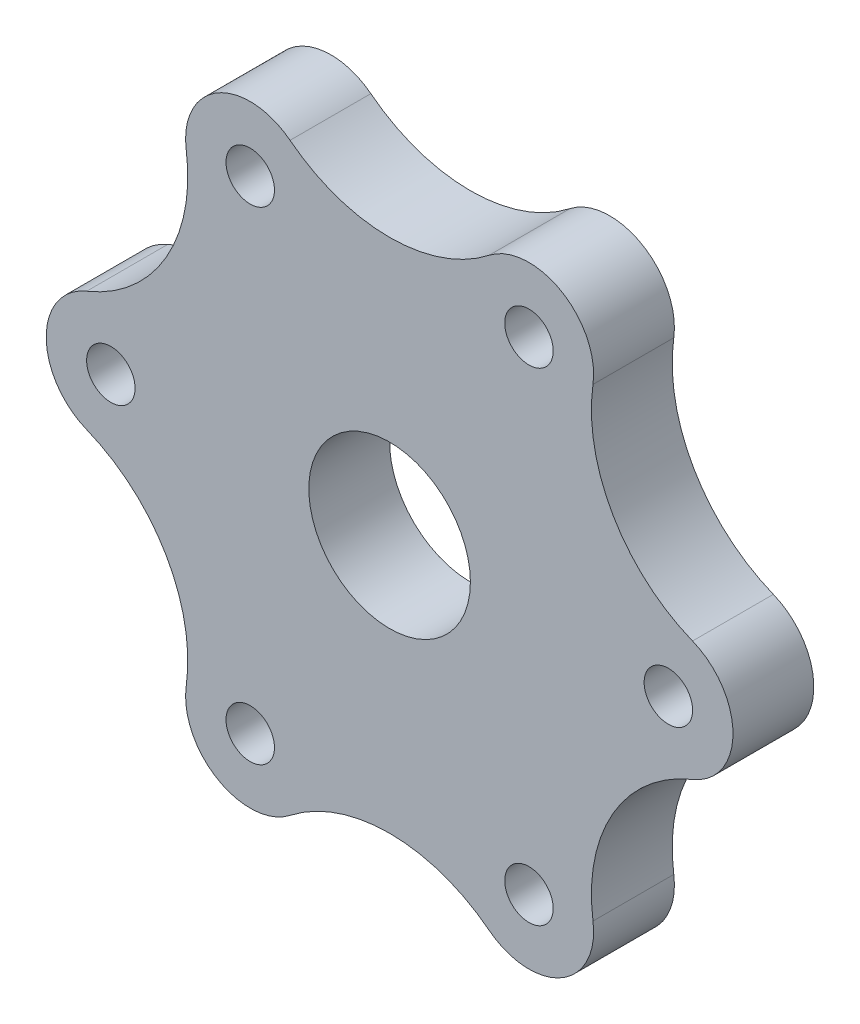
ISO-10303-21;
HEADER;
FILE_DESCRIPTION(('STEP AP214'),'2;1');
FILE_NAME('part.step','',(''),(''),'','','');
FILE_SCHEMA(('AUTOMOTIVE_DESIGN { 1 0 10303 214 1 1 1 1 }'));
ENDSEC;
DATA;
#1=APPLICATION_CONTEXT('core data for automotive mechanical design processes');
#2=APPLICATION_PROTOCOL_DEFINITION('international standard','automotive_design',2000,#1);
#3=PRODUCT_CONTEXT('',#1,'mechanical');
#4=PRODUCT('Part','Part','',(#3));
#5=PRODUCT_RELATED_PRODUCT_CATEGORY('part','',(#4));
#6=PRODUCT_DEFINITION_FORMATION('','',#4);
#7=PRODUCT_DEFINITION_CONTEXT('part definition',#1,'design');
#8=PRODUCT_DEFINITION('design','',#6,#7);
#9=PRODUCT_DEFINITION_SHAPE('','',#8);
#10=(LENGTH_UNIT() NAMED_UNIT(*) SI_UNIT(.MILLI.,.METRE.));
#11=(NAMED_UNIT(*) PLANE_ANGLE_UNIT() SI_UNIT($,.RADIAN.));
#12=(NAMED_UNIT(*) SI_UNIT($,.STERADIAN.) SOLID_ANGLE_UNIT());
#13=UNCERTAINTY_MEASURE_WITH_UNIT(LENGTH_MEASURE(1.E-05),#10,'distance_accuracy_value','');
#14=(GEOMETRIC_REPRESENTATION_CONTEXT(3) GLOBAL_UNCERTAINTY_ASSIGNED_CONTEXT((#13)) GLOBAL_UNIT_ASSIGNED_CONTEXT((#10,
#11,#12)) REPRESENTATION_CONTEXT('',''));
#15=CARTESIAN_POINT('',(0.,0.,0.));
#16=DIRECTION('',(0.,0.,1.));
#17=DIRECTION('',(1.,0.,0.));
#18=AXIS2_PLACEMENT_3D('',#15,#16,#17);
#19=CARTESIAN_POINT('',(39.7377372352733,12.9833011462506,5.));
#20=DIRECTION('',(0.,0.,1.));
#21=DIRECTION('',(1.,0.,0.));
#22=AXIS2_PLACEMENT_3D('',#19,#20,#21);
#23=PLANE('',#22);
#24=CARTESIAN_POINT('',(-34.5,0.,5.));
#25=DIRECTION('',(0.,0.,1.));
#26=DIRECTION('',(1.,0.,0.));
#27=AXIS2_PLACEMENT_3D('',#24,#25,#26);
#28=CIRCLE('',#27,2.99999999999993);
#29=CARTESIAN_POINT('',(-31.5000000000001,0.,5.));
#30=VERTEX_POINT('',#29);
#31=EDGE_CURVE('E309',#30,#30,#28,.T.);
#32=ORIENTED_EDGE('',*,*,#31,.F.);
#33=EDGE_LOOP('',(#32));
#34=FACE_BOUND('',#33,.T.);
#35=CARTESIAN_POINT('',(17.25,-29.8778764305631,5.));
#36=DIRECTION('',(0.,0.,1.));
#37=DIRECTION('',(1.,0.,0.));
#38=AXIS2_PLACEMENT_3D('',#35,#36,#37);
#39=CIRCLE('',#38,2.99999999999984);
#40=CARTESIAN_POINT('',(20.2499999999998,-29.8778764305631,5.));
#41=VERTEX_POINT('',#40);
#42=EDGE_CURVE('E321',#41,#41,#39,.T.);
#43=ORIENTED_EDGE('',*,*,#42,.F.);
#44=EDGE_LOOP('',(#43));
#45=FACE_BOUND('',#44,.T.);
#46=CARTESIAN_POINT('',(34.5,0.,5.));
#47=DIRECTION('',(0.,0.,1.));
#48=DIRECTION('',(1.,0.,0.));
#49=AXIS2_PLACEMENT_3D('',#46,#47,#48);
#50=CIRCLE('',#49,3.);
#51=CARTESIAN_POINT('',(37.5,0.,5.));
#52=VERTEX_POINT('',#51);
#53=EDGE_CURVE('E333',#52,#52,#50,.T.);
#54=ORIENTED_EDGE('',*,*,#53,.F.);
#55=EDGE_LOOP('',(#54));
#56=FACE_BOUND('',#55,.T.);
#57=CARTESIAN_POINT('',(44.9754744705465,25.9666022925012,5.));
#58=DIRECTION('',(0.,0.,-1.));
#59=DIRECTION('',(1.,0.,0.));
#60=AXIS2_PLACEMENT_3D('',#57,#58,#59);
#61=CIRCLE('',#60,20.0000000000001);
#62=CARTESIAN_POINT('',(37.4929927058704,7.4190292264289,5.));
#63=VERTEX_POINT('',#62);
#64=CARTESIAN_POINT('',(25.1715641344418,28.7603695339742,5.));
#65=VERTEX_POINT('',#64);
#66=EDGE_CURVE('E183',#63,#65,#61,.T.);
#67=ORIENTED_EDGE('',*,*,#66,.T.);
#68=CARTESIAN_POINT('',(17.25,29.8778764305631,5.));
#69=DIRECTION('',(0.,0.,1.));
#70=DIRECTION('',(1.,0.,0.));
#71=AXIS2_PLACEMENT_3D('',#68,#69,#70);
#72=CIRCLE('',#71,7.99999999999989);
#73=CARTESIAN_POINT('',(12.3214285714286,36.1793987604028,5.));
#74=VERTEX_POINT('',#73);
#75=EDGE_CURVE('E111',#65,#74,#72,.T.);
#76=ORIENTED_EDGE('',*,*,#75,.T.);
#77=CARTESIAN_POINT('',(0.,51.9332045850024,5.));
#78=DIRECTION('',(0.,0.,-1.));
#79=DIRECTION('',(1.,0.,0.));
#80=AXIS2_PLACEMENT_3D('',#77,#78,#79);
#81=CIRCLE('',#80,20.);
#82=CARTESIAN_POINT('',(-12.3214285714286,36.1793987604029,5.));
#83=VERTEX_POINT('',#82);
#84=EDGE_CURVE('E210',#74,#83,#81,.T.);
#85=ORIENTED_EDGE('',*,*,#84,.T.);
#86=CARTESIAN_POINT('',(-17.2499999999997,29.8778764305633,5.));
#87=DIRECTION('',(0.,0.,1.));
#88=DIRECTION('',(1.,0.,0.));
#89=AXIS2_PLACEMENT_3D('',#86,#87,#88);
#90=CIRCLE('',#89,7.99999999999999);
#91=CARTESIAN_POINT('',(-25.1715641344416,28.760369533974,5.));
#92=VERTEX_POINT('',#91);
#93=EDGE_CURVE('E229',#83,#92,#90,.T.);
#94=ORIENTED_EDGE('',*,*,#93,.T.);
#95=CARTESIAN_POINT('',(-44.9754744705466,25.9666022925011,5.));
#96=DIRECTION('',(0.,0.,-1.));
#97=DIRECTION('',(1.,0.,0.));
#98=AXIS2_PLACEMENT_3D('',#95,#96,#97);
#99=CIRCLE('',#98,20.0000000000001);
#100=CARTESIAN_POINT('',(-37.4929927058706,7.4190292264287,5.));
#101=VERTEX_POINT('',#100);
#102=EDGE_CURVE('E226',#92,#101,#99,.T.);
#103=ORIENTED_EDGE('',*,*,#102,.T.);
#104=CARTESIAN_POINT('',(-34.5,0.,5.));
#105=DIRECTION('',(0.,0.,1.));
#106=DIRECTION('',(1.,0.,0.));
#107=AXIS2_PLACEMENT_3D('',#104,#105,#106);
#108=CIRCLE('',#107,7.99999999999995);
#109=CARTESIAN_POINT('',(-37.4929927058703,-7.41902922642892,5.));
#110=VERTEX_POINT('',#109);
#111=EDGE_CURVE('E228',#101,#110,#108,.T.);
#112=ORIENTED_EDGE('',*,*,#111,.T.);
#113=CARTESIAN_POINT('',(-44.9754744705465,-25.9666022925012,5.));
#114=DIRECTION('',(0.,0.,-1.));
#115=DIRECTION('',(1.,0.,0.));
#116=AXIS2_PLACEMENT_3D('',#113,#114,#115);
#117=CIRCLE('',#116,20.);
#118=CARTESIAN_POINT('',(-25.1715641344418,-28.7603695339742,5.));
#119=VERTEX_POINT('',#118);
#120=EDGE_CURVE('E231',#110,#119,#117,.T.);
#121=ORIENTED_EDGE('',*,*,#120,.T.);
#122=CARTESIAN_POINT('',(-17.2499999999998,-29.8778764305633,5.));
#123=DIRECTION('',(0.,0.,1.));
#124=DIRECTION('',(1.,0.,0.));
#125=AXIS2_PLACEMENT_3D('',#122,#123,#124);
#126=CIRCLE('',#125,7.99999999999986);
#127=CARTESIAN_POINT('',(-12.3214285714285,-36.179398760403,5.));
#128=VERTEX_POINT('',#127);
#129=EDGE_CURVE('E237',#119,#128,#126,.T.);
#130=ORIENTED_EDGE('',*,*,#129,.T.);
#131=CARTESIAN_POINT('',(0.,-51.9332045850024,5.));
#132=DIRECTION('',(0.,0.,-1.));
#133=DIRECTION('',(1.,0.,0.));
#134=AXIS2_PLACEMENT_3D('',#131,#132,#133);
#135=CIRCLE('',#134,20.);
#136=CARTESIAN_POINT('',(12.3214285714286,-36.1793987604029,5.));
#137=VERTEX_POINT('',#136);
#138=EDGE_CURVE('E142',#128,#137,#135,.T.);
#139=ORIENTED_EDGE('',*,*,#138,.T.);
#140=CARTESIAN_POINT('',(17.25,-29.8778764305631,5.));
#141=DIRECTION('',(0.,0.,1.));
#142=DIRECTION('',(1.,0.,0.));
#143=AXIS2_PLACEMENT_3D('',#140,#141,#142);
#144=CIRCLE('',#143,7.99999999999999);
#145=CARTESIAN_POINT('',(25.1715641344419,-28.760369533974,5.));
#146=VERTEX_POINT('',#145);
#147=EDGE_CURVE('E136',#137,#146,#144,.T.);
#148=ORIENTED_EDGE('',*,*,#147,.T.);
#149=CARTESIAN_POINT('',(44.9754744705465,-25.9666022925012,5.));
#150=DIRECTION('',(0.,0.,-1.));
#151=DIRECTION('',(1.,0.,0.));
#152=AXIS2_PLACEMENT_3D('',#149,#150,#151);
#153=CIRCLE('',#152,20.);
#154=CARTESIAN_POINT('',(37.4929927058704,-7.41902922642888,5.));
#155=VERTEX_POINT('',#154);
#156=EDGE_CURVE('E140',#146,#155,#153,.T.);
#157=ORIENTED_EDGE('',*,*,#156,.T.);
#158=CARTESIAN_POINT('',(34.5,0.,5.));
#159=DIRECTION('',(0.,0.,1.));
#160=DIRECTION('',(1.,0.,0.));
#161=AXIS2_PLACEMENT_3D('',#158,#159,#160);
#162=CIRCLE('',#161,7.99999999999999);
#163=EDGE_CURVE('E56',#155,#63,#162,.T.);
#164=ORIENTED_EDGE('',*,*,#163,.T.);
#165=EDGE_LOOP('',(#67,#76,#85,#94,#103,#112,#121,#130,#139,#148,#157,#164));
#166=FACE_BOUND('',#165,.T.);
#167=CARTESIAN_POINT('',(0.,0.,5.));
#168=DIRECTION('',(0.,0.,1.));
#169=DIRECTION('',(1.,0.,0.));
#170=AXIS2_PLACEMENT_3D('',#167,#168,#169);
#171=CIRCLE('',#170,10.);
#172=CARTESIAN_POINT('',(10.,0.,5.));
#173=VERTEX_POINT('',#172);
#174=EDGE_CURVE('E164',#173,#173,#171,.T.);
#175=ORIENTED_EDGE('',*,*,#174,.F.);
#176=EDGE_LOOP('',(#175));
#177=FACE_BOUND('',#176,.T.);
#178=CARTESIAN_POINT('',(-17.2499999999997,29.8778764305633,5.));
#179=DIRECTION('',(0.,0.,1.));
#180=DIRECTION('',(1.,0.,0.));
#181=AXIS2_PLACEMENT_3D('',#178,#179,#180);
#182=CIRCLE('',#181,2.99999999999999);
#183=CARTESIAN_POINT('',(-14.2499999999997,29.8778764305633,5.));
#184=VERTEX_POINT('',#183);
#185=EDGE_CURVE('E327',#184,#184,#182,.T.);
#186=ORIENTED_EDGE('',*,*,#185,.F.);
#187=EDGE_LOOP('',(#186));
#188=FACE_BOUND('',#187,.T.);
#189=CARTESIAN_POINT('',(-17.2499999999998,-29.8778764305633,5.));
#190=DIRECTION('',(0.,0.,1.));
#191=DIRECTION('',(1.,0.,0.));
#192=AXIS2_PLACEMENT_3D('',#189,#190,#191);
#193=CIRCLE('',#192,2.99999999999966);
#194=CARTESIAN_POINT('',(-14.2500000000001,-29.8778764305633,5.));
#195=VERTEX_POINT('',#194);
#196=EDGE_CURVE('E315',#195,#195,#193,.T.);
#197=ORIENTED_EDGE('',*,*,#196,.F.);
#198=EDGE_LOOP('',(#197));
#199=FACE_BOUND('',#198,.T.);
#200=CARTESIAN_POINT('',(17.25,29.8778764305631,5.));
#201=DIRECTION('',(0.,0.,1.));
#202=DIRECTION('',(1.,0.,0.));
#203=AXIS2_PLACEMENT_3D('',#200,#201,#202);
#204=CIRCLE('',#203,2.99999999999988);
#205=CARTESIAN_POINT('',(20.2499999999999,29.8778764305631,5.));
#206=VERTEX_POINT('',#205);
#207=EDGE_CURVE('E300',#206,#206,#204,.T.);
#208=ORIENTED_EDGE('',*,*,#207,.F.);
#209=EDGE_LOOP('',(#208));
#210=FACE_BOUND('',#209,.T.);
#211=ADVANCED_FACE('F39',(#34,#45,#56,#166,#177,#188,#199,#210),#23,.T.);
#212=CARTESIAN_POINT('',(39.7377372352733,12.9833011462506,-5.));
#213=DIRECTION('',(0.,0.,1.));
#214=DIRECTION('',(1.,0.,0.));
#215=AXIS2_PLACEMENT_3D('',#212,#213,#214);
#216=PLANE('',#215);
#217=CARTESIAN_POINT('',(44.9754744705465,25.9666022925012,-5.));
#218=DIRECTION('',(0.,0.,-1.));
#219=DIRECTION('',(1.,0.,0.));
#220=AXIS2_PLACEMENT_3D('',#217,#218,#219);
#221=CIRCLE('',#220,20.0000000000001);
#222=CARTESIAN_POINT('',(37.4929927058704,7.4190292264289,-5.));
#223=VERTEX_POINT('',#222);
#224=CARTESIAN_POINT('',(25.1715641344418,28.7603695339742,-5.));
#225=VERTEX_POINT('',#224);
#226=EDGE_CURVE('E160',#223,#225,#221,.T.);
#227=ORIENTED_EDGE('',*,*,#226,.F.);
#228=CARTESIAN_POINT('',(34.5,0.,-5.));
#229=DIRECTION('',(0.,0.,1.));
#230=DIRECTION('',(1.,0.,0.));
#231=AXIS2_PLACEMENT_3D('',#228,#229,#230);
#232=CIRCLE('',#231,7.99999999999999);
#233=CARTESIAN_POINT('',(37.4929927058704,-7.41902922642888,-5.));
#234=VERTEX_POINT('',#233);
#235=EDGE_CURVE('E103',#234,#223,#232,.T.);
#236=ORIENTED_EDGE('',*,*,#235,.F.);
#237=CARTESIAN_POINT('',(44.9754744705465,-25.9666022925012,-5.));
#238=DIRECTION('',(0.,0.,-1.));
#239=DIRECTION('',(1.,0.,0.));
#240=AXIS2_PLACEMENT_3D('',#237,#238,#239);
#241=CIRCLE('',#240,20.);
#242=CARTESIAN_POINT('',(25.1715641344419,-28.760369533974,-5.));
#243=VERTEX_POINT('',#242);
#244=EDGE_CURVE('E97',#243,#234,#241,.T.);
#245=ORIENTED_EDGE('',*,*,#244,.F.);
#246=CARTESIAN_POINT('',(17.25,-29.8778764305631,-5.));
#247=DIRECTION('',(0.,0.,1.));
#248=DIRECTION('',(1.,0.,0.));
#249=AXIS2_PLACEMENT_3D('',#246,#247,#248);
#250=CIRCLE('',#249,7.99999999999999);
#251=CARTESIAN_POINT('',(12.3214285714286,-36.1793987604029,-5.));
#252=VERTEX_POINT('',#251);
#253=EDGE_CURVE('E150',#252,#243,#250,.T.);
#254=ORIENTED_EDGE('',*,*,#253,.F.);
#255=CARTESIAN_POINT('',(0.,-51.9332045850024,-5.));
#256=DIRECTION('',(0.,0.,-1.));
#257=DIRECTION('',(1.,0.,0.));
#258=AXIS2_PLACEMENT_3D('',#255,#256,#257);
#259=CIRCLE('',#258,20.);
#260=CARTESIAN_POINT('',(-12.3214285714285,-36.179398760403,-5.));
#261=VERTEX_POINT('',#260);
#262=EDGE_CURVE('E178',#261,#252,#259,.T.);
#263=ORIENTED_EDGE('',*,*,#262,.F.);
#264=CARTESIAN_POINT('',(-17.2499999999998,-29.8778764305633,-5.));
#265=DIRECTION('',(0.,0.,1.));
#266=DIRECTION('',(1.,0.,0.));
#267=AXIS2_PLACEMENT_3D('',#264,#265,#266);
#268=CIRCLE('',#267,7.99999999999986);
#269=CARTESIAN_POINT('',(-25.1715641344418,-28.7603695339742,-5.));
#270=VERTEX_POINT('',#269);
#271=EDGE_CURVE('E176',#270,#261,#268,.T.);
#272=ORIENTED_EDGE('',*,*,#271,.F.);
#273=CARTESIAN_POINT('',(-44.9754744705465,-25.9666022925012,-5.));
#274=DIRECTION('',(0.,0.,-1.));
#275=DIRECTION('',(1.,0.,0.));
#276=AXIS2_PLACEMENT_3D('',#273,#274,#275);
#277=CIRCLE('',#276,20.);
#278=CARTESIAN_POINT('',(-37.4929927058703,-7.41902922642892,-5.));
#279=VERTEX_POINT('',#278);
#280=EDGE_CURVE('E174',#279,#270,#277,.T.);
#281=ORIENTED_EDGE('',*,*,#280,.F.);
#282=CARTESIAN_POINT('',(-34.5,0.,-5.));
#283=DIRECTION('',(0.,0.,1.));
#284=DIRECTION('',(1.,0.,0.));
#285=AXIS2_PLACEMENT_3D('',#282,#283,#284);
#286=CIRCLE('',#285,7.99999999999995);
#287=CARTESIAN_POINT('',(-37.4929927058706,7.4190292264287,-5.));
#288=VERTEX_POINT('',#287);
#289=EDGE_CURVE('E172',#288,#279,#286,.T.);
#290=ORIENTED_EDGE('',*,*,#289,.F.);
#291=CARTESIAN_POINT('',(-44.9754744705466,25.9666022925011,-5.));
#292=DIRECTION('',(0.,0.,-1.));
#293=DIRECTION('',(1.,0.,0.));
#294=AXIS2_PLACEMENT_3D('',#291,#292,#293);
#295=CIRCLE('',#294,20.0000000000001);
#296=CARTESIAN_POINT('',(-25.1715641344416,28.760369533974,-5.));
#297=VERTEX_POINT('',#296);
#298=EDGE_CURVE('E170',#297,#288,#295,.T.);
#299=ORIENTED_EDGE('',*,*,#298,.F.);
#300=CARTESIAN_POINT('',(-17.2499999999997,29.8778764305633,-5.));
#301=DIRECTION('',(0.,0.,1.));
#302=DIRECTION('',(1.,0.,0.));
#303=AXIS2_PLACEMENT_3D('',#300,#301,#302);
#304=CIRCLE('',#303,7.99999999999999);
#305=CARTESIAN_POINT('',(-12.3214285714286,36.1793987604029,-5.));
#306=VERTEX_POINT('',#305);
#307=EDGE_CURVE('E168',#306,#297,#304,.T.);
#308=ORIENTED_EDGE('',*,*,#307,.F.);
#309=CARTESIAN_POINT('',(0.,51.9332045850024,-5.));
#310=DIRECTION('',(0.,0.,-1.));
#311=DIRECTION('',(1.,0.,0.));
#312=AXIS2_PLACEMENT_3D('',#309,#310,#311);
#313=CIRCLE('',#312,20.);
#314=CARTESIAN_POINT('',(12.3214285714286,36.1793987604028,-5.));
#315=VERTEX_POINT('',#314);
#316=EDGE_CURVE('E166',#315,#306,#313,.T.);
#317=ORIENTED_EDGE('',*,*,#316,.F.);
#318=CARTESIAN_POINT('',(17.25,29.8778764305631,-5.));
#319=DIRECTION('',(0.,0.,1.));
#320=DIRECTION('',(1.,0.,0.));
#321=AXIS2_PLACEMENT_3D('',#318,#319,#320);
#322=CIRCLE('',#321,7.99999999999989);
#323=EDGE_CURVE('E163',#225,#315,#322,.T.);
#324=ORIENTED_EDGE('',*,*,#323,.F.);
#325=EDGE_LOOP('',(#227,#236,#245,#254,#263,#272,#281,#290,#299,#308,#317,#324));
#326=FACE_BOUND('',#325,.T.);
#327=CARTESIAN_POINT('',(0.,0.,-5.));
#328=DIRECTION('',(0.,0.,1.));
#329=DIRECTION('',(1.,0.,0.));
#330=AXIS2_PLACEMENT_3D('',#327,#328,#329);
#331=CIRCLE('',#330,10.);
#332=CARTESIAN_POINT('',(10.,0.,-5.));
#333=VERTEX_POINT('',#332);
#334=EDGE_CURVE('E336',#333,#333,#331,.T.);
#335=ORIENTED_EDGE('',*,*,#334,.T.);
#336=EDGE_LOOP('',(#335));
#337=FACE_BOUND('',#336,.T.);
#338=CARTESIAN_POINT('',(34.5,0.,-5.));
#339=DIRECTION('',(0.,0.,1.));
#340=DIRECTION('',(1.,0.,0.));
#341=AXIS2_PLACEMENT_3D('',#338,#339,#340);
#342=CIRCLE('',#341,3.);
#343=CARTESIAN_POINT('',(37.5,0.,-5.));
#344=VERTEX_POINT('',#343);
#345=EDGE_CURVE('E330',#344,#344,#342,.T.);
#346=ORIENTED_EDGE('',*,*,#345,.T.);
#347=EDGE_LOOP('',(#346));
#348=FACE_BOUND('',#347,.T.);
#349=CARTESIAN_POINT('',(-17.2499999999997,29.8778764305633,-5.));
#350=DIRECTION('',(0.,0.,1.));
#351=DIRECTION('',(1.,0.,0.));
#352=AXIS2_PLACEMENT_3D('',#349,#350,#351);
#353=CIRCLE('',#352,2.99999999999999);
#354=CARTESIAN_POINT('',(-14.2499999999997,29.8778764305633,-5.));
#355=VERTEX_POINT('',#354);
#356=EDGE_CURVE('E324',#355,#355,#353,.T.);
#357=ORIENTED_EDGE('',*,*,#356,.T.);
#358=EDGE_LOOP('',(#357));
#359=FACE_BOUND('',#358,.T.);
#360=CARTESIAN_POINT('',(17.25,-29.8778764305631,-5.));
#361=DIRECTION('',(0.,0.,1.));
#362=DIRECTION('',(1.,0.,0.));
#363=AXIS2_PLACEMENT_3D('',#360,#361,#362);
#364=CIRCLE('',#363,2.99999999999984);
#365=CARTESIAN_POINT('',(20.2499999999998,-29.8778764305631,-5.));
#366=VERTEX_POINT('',#365);
#367=EDGE_CURVE('E318',#366,#366,#364,.T.);
#368=ORIENTED_EDGE('',*,*,#367,.T.);
#369=EDGE_LOOP('',(#368));
#370=FACE_BOUND('',#369,.T.);
#371=CARTESIAN_POINT('',(-17.2499999999998,-29.8778764305633,-5.));
#372=DIRECTION('',(0.,0.,1.));
#373=DIRECTION('',(1.,0.,0.));
#374=AXIS2_PLACEMENT_3D('',#371,#372,#373);
#375=CIRCLE('',#374,2.99999999999966);
#376=CARTESIAN_POINT('',(-14.2500000000001,-29.8778764305633,-5.));
#377=VERTEX_POINT('',#376);
#378=EDGE_CURVE('E312',#377,#377,#375,.T.);
#379=ORIENTED_EDGE('',*,*,#378,.T.);
#380=EDGE_LOOP('',(#379));
#381=FACE_BOUND('',#380,.T.);
#382=CARTESIAN_POINT('',(-34.5,0.,-5.));
#383=DIRECTION('',(0.,0.,1.));
#384=DIRECTION('',(1.,0.,0.));
#385=AXIS2_PLACEMENT_3D('',#382,#383,#384);
#386=CIRCLE('',#385,2.99999999999993);
#387=CARTESIAN_POINT('',(-31.5000000000001,0.,-5.));
#388=VERTEX_POINT('',#387);
#389=EDGE_CURVE('E306',#388,#388,#386,.T.);
#390=ORIENTED_EDGE('',*,*,#389,.T.);
#391=EDGE_LOOP('',(#390));
#392=FACE_BOUND('',#391,.T.);
#393=CARTESIAN_POINT('',(17.25,29.8778764305631,-5.));
#394=DIRECTION('',(0.,0.,1.));
#395=DIRECTION('',(1.,0.,0.));
#396=AXIS2_PLACEMENT_3D('',#393,#394,#395);
#397=CIRCLE('',#396,2.99999999999988);
#398=CARTESIAN_POINT('',(20.2499999999999,29.8778764305631,-5.));
#399=VERTEX_POINT('',#398);
#400=EDGE_CURVE('E303',#399,#399,#397,.T.);
#401=ORIENTED_EDGE('',*,*,#400,.T.);
#402=EDGE_LOOP('',(#401));
#403=FACE_BOUND('',#402,.T.);
#404=ADVANCED_FACE('F214',(#326,#337,#348,#359,#370,#381,#392,#403),#216,.F.);
#405=CARTESIAN_POINT('',(44.9754744705465,25.9666022925012,5.));
#406=DIRECTION('',(0.,0.,-1.));
#407=DIRECTION('',(-1.,0.,0.));
#408=AXIS2_PLACEMENT_3D('',#405,#406,#407);
#409=CYLINDRICAL_SURFACE('',#408,20.0000000000001);
#410=ORIENTED_EDGE('',*,*,#226,.T.);
#411=DIRECTION('',(0.,0.,-1.));
#412=VECTOR('',#411,1.);
#413=CARTESIAN_POINT('',(25.1715641344418,28.7603695339742,5.));
#414=LINE('',#413,#412);
#415=EDGE_CURVE('E11',#65,#225,#414,.T.);
#416=ORIENTED_EDGE('',*,*,#415,.F.);
#417=ORIENTED_EDGE('',*,*,#66,.F.);
#418=DIRECTION('',(0.,0.,-1.));
#419=VECTOR('',#418,1.);
#420=CARTESIAN_POINT('',(37.4929927058704,7.4190292264289,5.));
#421=LINE('',#420,#419);
#422=EDGE_CURVE('E156',#63,#223,#421,.T.);
#423=ORIENTED_EDGE('',*,*,#422,.T.);
#424=EDGE_LOOP('',(#410,#416,#417,#423));
#425=FACE_BOUND('',#424,.T.);
#426=ADVANCED_FACE('F41',(#425),#409,.F.);
#427=CARTESIAN_POINT('',(17.25,29.8778764305631,5.));
#428=DIRECTION('',(0.,0.,-1.));
#429=DIRECTION('',(-1.,0.,0.));
#430=AXIS2_PLACEMENT_3D('',#427,#428,#429);
#431=CYLINDRICAL_SURFACE('',#430,7.99999999999989);
#432=ORIENTED_EDGE('',*,*,#323,.T.);
#433=DIRECTION('',(0.,0.,-1.));
#434=VECTOR('',#433,1.);
#435=CARTESIAN_POINT('',(12.3214285714286,36.1793987604028,5.));
#436=LINE('',#435,#434);
#437=EDGE_CURVE('E48',#74,#315,#436,.T.);
#438=ORIENTED_EDGE('',*,*,#437,.F.);
#439=ORIENTED_EDGE('',*,*,#75,.F.);
#440=ORIENTED_EDGE('',*,*,#415,.T.);
#441=EDGE_LOOP('',(#432,#438,#439,#440));
#442=FACE_BOUND('',#441,.T.);
#443=ADVANCED_FACE('F446',(#442),#431,.T.);
#444=CARTESIAN_POINT('',(0.,51.9332045850024,5.));
#445=DIRECTION('',(0.,0.,-1.));
#446=DIRECTION('',(-1.,0.,0.));
#447=AXIS2_PLACEMENT_3D('',#444,#445,#446);
#448=CYLINDRICAL_SURFACE('',#447,20.);
#449=ORIENTED_EDGE('',*,*,#316,.T.);
#450=DIRECTION('',(0.,0.,-1.));
#451=VECTOR('',#450,1.);
#452=CARTESIAN_POINT('',(-12.3214285714286,36.1793987604029,5.));
#453=LINE('',#452,#451);
#454=EDGE_CURVE('E202',#83,#306,#453,.T.);
#455=ORIENTED_EDGE('',*,*,#454,.F.);
#456=ORIENTED_EDGE('',*,*,#84,.F.);
#457=ORIENTED_EDGE('',*,*,#437,.T.);
#458=EDGE_LOOP('',(#449,#455,#456,#457));
#459=FACE_BOUND('',#458,.T.);
#460=ADVANCED_FACE('F208',(#459),#448,.F.);
#461=CARTESIAN_POINT('',(-17.2499999999997,29.8778764305633,5.));
#462=DIRECTION('',(0.,0.,-1.));
#463=DIRECTION('',(-1.,0.,0.));
#464=AXIS2_PLACEMENT_3D('',#461,#462,#463);
#465=CYLINDRICAL_SURFACE('',#464,7.99999999999999);
#466=ORIENTED_EDGE('',*,*,#307,.T.);
#467=DIRECTION('',(0.,0.,-1.));
#468=VECTOR('',#467,1.);
#469=CARTESIAN_POINT('',(-25.1715641344416,28.760369533974,5.));
#470=LINE('',#469,#468);
#471=EDGE_CURVE('E199',#92,#297,#470,.T.);
#472=ORIENTED_EDGE('',*,*,#471,.F.);
#473=ORIENTED_EDGE('',*,*,#93,.F.);
#474=ORIENTED_EDGE('',*,*,#454,.T.);
#475=EDGE_LOOP('',(#466,#472,#473,#474));
#476=FACE_BOUND('',#475,.T.);
#477=ADVANCED_FACE('F220',(#476),#465,.T.);
#478=CARTESIAN_POINT('',(-44.9754744705466,25.9666022925011,5.));
#479=DIRECTION('',(0.,0.,-1.));
#480=DIRECTION('',(-1.,0.,0.));
#481=AXIS2_PLACEMENT_3D('',#478,#479,#480);
#482=CYLINDRICAL_SURFACE('',#481,20.0000000000001);
#483=ORIENTED_EDGE('',*,*,#298,.T.);
#484=DIRECTION('',(0.,0.,-1.));
#485=VECTOR('',#484,1.);
#486=CARTESIAN_POINT('',(-37.4929927058706,7.4190292264287,5.));
#487=LINE('',#486,#485);
#488=EDGE_CURVE('E196',#101,#288,#487,.T.);
#489=ORIENTED_EDGE('',*,*,#488,.F.);
#490=ORIENTED_EDGE('',*,*,#102,.F.);
#491=ORIENTED_EDGE('',*,*,#471,.T.);
#492=EDGE_LOOP('',(#483,#489,#490,#491));
#493=FACE_BOUND('',#492,.T.);
#494=ADVANCED_FACE('F224',(#493),#482,.F.);
#495=CARTESIAN_POINT('',(-34.5,0.,5.));
#496=DIRECTION('',(0.,0.,-1.));
#497=DIRECTION('',(-1.,0.,0.));
#498=AXIS2_PLACEMENT_3D('',#495,#496,#497);
#499=CYLINDRICAL_SURFACE('',#498,7.99999999999995);
#500=ORIENTED_EDGE('',*,*,#289,.T.);
#501=DIRECTION('',(0.,0.,-1.));
#502=VECTOR('',#501,1.);
#503=CARTESIAN_POINT('',(-37.4929927058703,-7.41902922642892,5.));
#504=LINE('',#503,#502);
#505=EDGE_CURVE('E193',#110,#279,#504,.T.);
#506=ORIENTED_EDGE('',*,*,#505,.F.);
#507=ORIENTED_EDGE('',*,*,#111,.F.);
#508=ORIENTED_EDGE('',*,*,#488,.T.);
#509=EDGE_LOOP('',(#500,#506,#507,#508));
#510=FACE_BOUND('',#509,.T.);
#511=ADVANCED_FACE('F419',(#510),#499,.T.);
#512=CARTESIAN_POINT('',(-44.9754744705465,-25.9666022925012,5.));
#513=DIRECTION('',(0.,0.,-1.));
#514=DIRECTION('',(-1.,0.,0.));
#515=AXIS2_PLACEMENT_3D('',#512,#513,#514);
#516=CYLINDRICAL_SURFACE('',#515,20.);
#517=ORIENTED_EDGE('',*,*,#280,.T.);
#518=DIRECTION('',(0.,0.,-1.));
#519=VECTOR('',#518,1.);
#520=CARTESIAN_POINT('',(-25.1715641344418,-28.7603695339742,5.));
#521=LINE('',#520,#519);
#522=EDGE_CURVE('E190',#119,#270,#521,.T.);
#523=ORIENTED_EDGE('',*,*,#522,.F.);
#524=ORIENTED_EDGE('',*,*,#120,.F.);
#525=ORIENTED_EDGE('',*,*,#505,.T.);
#526=EDGE_LOOP('',(#517,#523,#524,#525));
#527=FACE_BOUND('',#526,.T.);
#528=ADVANCED_FACE('F424',(#527),#516,.F.);
#529=CARTESIAN_POINT('',(-17.2499999999998,-29.8778764305633,5.));
#530=DIRECTION('',(0.,0.,-1.));
#531=DIRECTION('',(-1.,0.,0.));
#532=AXIS2_PLACEMENT_3D('',#529,#530,#531);
#533=CYLINDRICAL_SURFACE('',#532,7.99999999999986);
#534=ORIENTED_EDGE('',*,*,#271,.T.);
#535=DIRECTION('',(0.,0.,-1.));
#536=VECTOR('',#535,1.);
#537=CARTESIAN_POINT('',(-12.3214285714285,-36.179398760403,5.));
#538=LINE('',#537,#536);
#539=EDGE_CURVE('E187',#128,#261,#538,.T.);
#540=ORIENTED_EDGE('',*,*,#539,.F.);
#541=ORIENTED_EDGE('',*,*,#129,.F.);
#542=ORIENTED_EDGE('',*,*,#522,.T.);
#543=EDGE_LOOP('',(#534,#540,#541,#542));
#544=FACE_BOUND('',#543,.T.);
#545=ADVANCED_FACE('F243',(#544),#533,.T.);
#546=CARTESIAN_POINT('',(0.,-51.9332045850024,5.));
#547=DIRECTION('',(0.,0.,-1.));
#548=DIRECTION('',(-1.,0.,0.));
#549=AXIS2_PLACEMENT_3D('',#546,#547,#548);
#550=CYLINDRICAL_SURFACE('',#549,20.);
#551=ORIENTED_EDGE('',*,*,#262,.T.);
#552=DIRECTION('',(0.,0.,-1.));
#553=VECTOR('',#552,1.);
#554=CARTESIAN_POINT('',(12.3214285714286,-36.1793987604029,5.));
#555=LINE('',#554,#553);
#556=EDGE_CURVE('E151',#137,#252,#555,.T.);
#557=ORIENTED_EDGE('',*,*,#556,.F.);
#558=ORIENTED_EDGE('',*,*,#138,.F.);
#559=ORIENTED_EDGE('',*,*,#539,.T.);
#560=EDGE_LOOP('',(#551,#557,#558,#559));
#561=FACE_BOUND('',#560,.T.);
#562=ADVANCED_FACE('F247',(#561),#550,.F.);
#563=CARTESIAN_POINT('',(17.25,-29.8778764305631,5.));
#564=DIRECTION('',(0.,0.,-1.));
#565=DIRECTION('',(-1.,0.,0.));
#566=AXIS2_PLACEMENT_3D('',#563,#564,#565);
#567=CYLINDRICAL_SURFACE('',#566,7.99999999999999);
#568=ORIENTED_EDGE('',*,*,#253,.T.);
#569=DIRECTION('',(0.,0.,-1.));
#570=VECTOR('',#569,1.);
#571=CARTESIAN_POINT('',(25.1715641344419,-28.760369533974,5.));
#572=LINE('',#571,#570);
#573=EDGE_CURVE('E147',#146,#243,#572,.T.);
#574=ORIENTED_EDGE('',*,*,#573,.F.);
#575=ORIENTED_EDGE('',*,*,#147,.F.);
#576=ORIENTED_EDGE('',*,*,#556,.T.);
#577=EDGE_LOOP('',(#568,#574,#575,#576));
#578=FACE_BOUND('',#577,.T.);
#579=ADVANCED_FACE('F148',(#578),#567,.T.);
#580=CARTESIAN_POINT('',(44.9754744705465,-25.9666022925012,5.));
#581=DIRECTION('',(0.,0.,-1.));
#582=DIRECTION('',(-1.,0.,0.));
#583=AXIS2_PLACEMENT_3D('',#580,#581,#582);
#584=CYLINDRICAL_SURFACE('',#583,20.);
#585=ORIENTED_EDGE('',*,*,#244,.T.);
#586=DIRECTION('',(0.,0.,-1.));
#587=VECTOR('',#586,1.);
#588=CARTESIAN_POINT('',(37.4929927058704,-7.41902922642888,5.));
#589=LINE('',#588,#587);
#590=EDGE_CURVE('E152',#155,#234,#589,.T.);
#591=ORIENTED_EDGE('',*,*,#590,.F.);
#592=ORIENTED_EDGE('',*,*,#156,.F.);
#593=ORIENTED_EDGE('',*,*,#573,.T.);
#594=EDGE_LOOP('',(#585,#591,#592,#593));
#595=FACE_BOUND('',#594,.T.);
#596=ADVANCED_FACE('F154',(#595),#584,.F.);
#597=CARTESIAN_POINT('',(34.5,0.,5.));
#598=DIRECTION('',(0.,0.,-1.));
#599=DIRECTION('',(-1.,0.,0.));
#600=AXIS2_PLACEMENT_3D('',#597,#598,#599);
#601=CYLINDRICAL_SURFACE('',#600,7.99999999999999);
#602=ORIENTED_EDGE('',*,*,#235,.T.);
#603=ORIENTED_EDGE('',*,*,#422,.F.);
#604=ORIENTED_EDGE('',*,*,#163,.F.);
#605=ORIENTED_EDGE('',*,*,#590,.T.);
#606=EDGE_LOOP('',(#602,#603,#604,#605));
#607=FACE_BOUND('',#606,.T.);
#608=ADVANCED_FACE('F251',(#607),#601,.T.);
#609=CARTESIAN_POINT('',(0.,0.,5.));
#610=DIRECTION('',(0.,0.,-1.));
#611=DIRECTION('',(-1.,0.,0.));
#612=AXIS2_PLACEMENT_3D('',#609,#610,#611);
#613=CYLINDRICAL_SURFACE('',#612,10.);
#614=ORIENTED_EDGE('',*,*,#174,.T.);
#615=EDGE_LOOP('',(#614));
#616=FACE_BOUND('',#615,.T.);
#617=ORIENTED_EDGE('',*,*,#334,.F.);
#618=EDGE_LOOP('',(#617));
#619=FACE_BOUND('',#618,.T.);
#620=ADVANCED_FACE('F253',(#616,#619),#613,.F.);
#621=CARTESIAN_POINT('',(34.5,0.,5.));
#622=DIRECTION('',(0.,0.,-1.));
#623=DIRECTION('',(-1.,0.,0.));
#624=AXIS2_PLACEMENT_3D('',#621,#622,#623);
#625=CYLINDRICAL_SURFACE('',#624,3.);
#626=ORIENTED_EDGE('',*,*,#53,.T.);
#627=EDGE_LOOP('',(#626));
#628=FACE_BOUND('',#627,.T.);
#629=ORIENTED_EDGE('',*,*,#345,.F.);
#630=EDGE_LOOP('',(#629));
#631=FACE_BOUND('',#630,.T.);
#632=ADVANCED_FACE('F259',(#628,#631),#625,.F.);
#633=CARTESIAN_POINT('',(-17.2499999999997,29.8778764305633,5.));
#634=DIRECTION('',(0.,0.,-1.));
#635=DIRECTION('',(-1.,0.,0.));
#636=AXIS2_PLACEMENT_3D('',#633,#634,#635);
#637=CYLINDRICAL_SURFACE('',#636,2.99999999999999);
#638=ORIENTED_EDGE('',*,*,#185,.T.);
#639=EDGE_LOOP('',(#638));
#640=FACE_BOUND('',#639,.T.);
#641=ORIENTED_EDGE('',*,*,#356,.F.);
#642=EDGE_LOOP('',(#641));
#643=FACE_BOUND('',#642,.T.);
#644=ADVANCED_FACE('F275',(#640,#643),#637,.F.);
#645=CARTESIAN_POINT('',(17.25,-29.8778764305631,5.));
#646=DIRECTION('',(0.,0.,-1.));
#647=DIRECTION('',(-1.,0.,0.));
#648=AXIS2_PLACEMENT_3D('',#645,#646,#647);
#649=CYLINDRICAL_SURFACE('',#648,2.99999999999984);
#650=ORIENTED_EDGE('',*,*,#42,.T.);
#651=EDGE_LOOP('',(#650));
#652=FACE_BOUND('',#651,.T.);
#653=ORIENTED_EDGE('',*,*,#367,.F.);
#654=EDGE_LOOP('',(#653));
#655=FACE_BOUND('',#654,.T.);
#656=ADVANCED_FACE('F279',(#652,#655),#649,.F.);
#657=CARTESIAN_POINT('',(-17.2499999999998,-29.8778764305633,5.));
#658=DIRECTION('',(0.,0.,-1.));
#659=DIRECTION('',(-1.,0.,0.));
#660=AXIS2_PLACEMENT_3D('',#657,#658,#659);
#661=CYLINDRICAL_SURFACE('',#660,2.99999999999966);
#662=ORIENTED_EDGE('',*,*,#196,.T.);
#663=EDGE_LOOP('',(#662));
#664=FACE_BOUND('',#663,.T.);
#665=ORIENTED_EDGE('',*,*,#378,.F.);
#666=EDGE_LOOP('',(#665));
#667=FACE_BOUND('',#666,.T.);
#668=ADVANCED_FACE('F283',(#664,#667),#661,.F.);
#669=CARTESIAN_POINT('',(-34.5,0.,5.));
#670=DIRECTION('',(0.,0.,-1.));
#671=DIRECTION('',(-1.,0.,0.));
#672=AXIS2_PLACEMENT_3D('',#669,#670,#671);
#673=CYLINDRICAL_SURFACE('',#672,2.99999999999993);
#674=ORIENTED_EDGE('',*,*,#31,.T.);
#675=EDGE_LOOP('',(#674));
#676=FACE_BOUND('',#675,.T.);
#677=ORIENTED_EDGE('',*,*,#389,.F.);
#678=EDGE_LOOP('',(#677));
#679=FACE_BOUND('',#678,.T.);
#680=ADVANCED_FACE('F287',(#676,#679),#673,.F.);
#681=CARTESIAN_POINT('',(17.25,29.8778764305631,5.));
#682=DIRECTION('',(0.,0.,-1.));
#683=DIRECTION('',(-1.,0.,0.));
#684=AXIS2_PLACEMENT_3D('',#681,#682,#683);
#685=CYLINDRICAL_SURFACE('',#684,2.99999999999988);
#686=ORIENTED_EDGE('',*,*,#207,.T.);
#687=EDGE_LOOP('',(#686));
#688=FACE_BOUND('',#687,.T.);
#689=ORIENTED_EDGE('',*,*,#400,.F.);
#690=EDGE_LOOP('',(#689));
#691=FACE_BOUND('',#690,.T.);
#692=ADVANCED_FACE('F291',(#688,#691),#685,.F.);
#693=CLOSED_SHELL('',(#211,#404,#426,#443,#460,#477,#494,#511,#528,#545,#562,#579,#596,#608,
#620,#632,#644,#656,#668,#680,#692));
#694=MANIFOLD_SOLID_BREP('B2',#693);
#695=ADVANCED_BREP_SHAPE_REPRESENTATION('',(#18,#694),#14);
#696=SHAPE_DEFINITION_REPRESENTATION(#9,#695);
ENDSEC;
END-ISO-10303-21;
